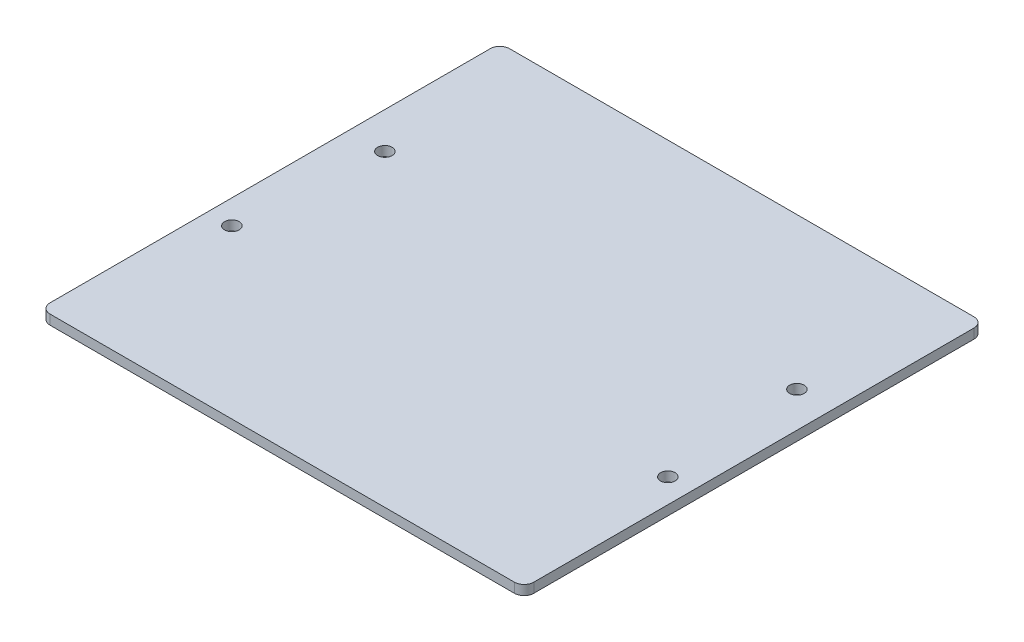
ISO-10303-21;
HEADER;
FILE_DESCRIPTION(('STEP AP214'),'2;1');
FILE_NAME('part.step','',(''),(''),'','','');
FILE_SCHEMA(('AUTOMOTIVE_DESIGN { 1 0 10303 214 1 1 1 1 }'));
ENDSEC;
DATA;
#1=APPLICATION_CONTEXT('core data for automotive mechanical design processes');
#2=APPLICATION_PROTOCOL_DEFINITION('international standard','automotive_design',2000,#1);
#3=PRODUCT_CONTEXT('',#1,'mechanical');
#4=PRODUCT('Part','Part','',(#3));
#5=PRODUCT_RELATED_PRODUCT_CATEGORY('part','',(#4));
#6=PRODUCT_DEFINITION_FORMATION('','',#4);
#7=PRODUCT_DEFINITION_CONTEXT('part definition',#1,'design');
#8=PRODUCT_DEFINITION('design','',#6,#7);
#9=PRODUCT_DEFINITION_SHAPE('','',#8);
#10=(LENGTH_UNIT() NAMED_UNIT(*) SI_UNIT(.MILLI.,.METRE.));
#11=(NAMED_UNIT(*) PLANE_ANGLE_UNIT() SI_UNIT($,.RADIAN.));
#12=(NAMED_UNIT(*) SI_UNIT($,.STERADIAN.) SOLID_ANGLE_UNIT());
#13=UNCERTAINTY_MEASURE_WITH_UNIT(LENGTH_MEASURE(1.E-05),#10,'distance_accuracy_value','');
#14=(GEOMETRIC_REPRESENTATION_CONTEXT(3) GLOBAL_UNCERTAINTY_ASSIGNED_CONTEXT((#13)) GLOBAL_UNIT_ASSIGNED_CONTEXT((#10,
#11,#12)) REPRESENTATION_CONTEXT('',''));
#15=CARTESIAN_POINT('',(0.,0.,0.));
#16=DIRECTION('',(0.,0.,1.));
#17=DIRECTION('',(1.,0.,0.));
#18=AXIS2_PLACEMENT_3D('',#15,#16,#17);
#19=CARTESIAN_POINT('',(0.,2.,0.));
#20=DIRECTION('',(0.,-1.,0.));
#21=DIRECTION('',(0.,0.,-1.));
#22=AXIS2_PLACEMENT_3D('',#19,#20,#21);
#23=PLANE('',#22);
#24=CARTESIAN_POINT('',(-45.,2.,12.906));
#25=DIRECTION('',(0.,1.,0.));
#26=DIRECTION('',(0.,0.,1.));
#27=AXIS2_PLACEMENT_3D('',#24,#25,#26);
#28=CIRCLE('',#27,1.50000000000002);
#29=CARTESIAN_POINT('',(-45.,2.,14.406));
#30=VERTEX_POINT('',#29);
#31=EDGE_CURVE('E205',#30,#30,#28,.T.);
#32=ORIENTED_EDGE('',*,*,#31,.F.);
#33=EDGE_LOOP('',(#32));
#34=FACE_BOUND('',#33,.T.);
#35=CARTESIAN_POINT('',(-42.5,2.,-16.216));
#36=DIRECTION('',(0.,1.,0.));
#37=DIRECTION('',(0.,0.,1.));
#38=AXIS2_PLACEMENT_3D('',#35,#36,#37);
#39=CIRCLE('',#38,1.50000000000002);
#40=CARTESIAN_POINT('',(-42.5,2.,-14.716));
#41=VERTEX_POINT('',#40);
#42=EDGE_CURVE('E199',#41,#41,#39,.T.);
#43=ORIENTED_EDGE('',*,*,#42,.F.);
#44=EDGE_LOOP('',(#43));
#45=FACE_BOUND('',#44,.T.);
#46=DIRECTION('',(-1.,0.,0.));
#47=VECTOR('',#46,1.);
#48=CARTESIAN_POINT('',(-50.,2.,-47.5));
#49=LINE('',#48,#47);
#50=CARTESIAN_POINT('',(48.,2.,-47.5));
#51=VERTEX_POINT('',#50);
#52=CARTESIAN_POINT('',(-48.,2.,-47.5));
#53=VERTEX_POINT('',#52);
#54=EDGE_CURVE('E173',#51,#53,#49,.T.);
#55=ORIENTED_EDGE('',*,*,#54,.T.);
#56=CARTESIAN_POINT('',(-48.,2.,-45.5));
#57=DIRECTION('',(0.,-1.,0.));
#58=DIRECTION('',(0.,0.,-1.));
#59=AXIS2_PLACEMENT_3D('',#56,#57,#58);
#60=CIRCLE('',#59,2.);
#61=CARTESIAN_POINT('',(-50.,2.,-45.5));
#62=VERTEX_POINT('',#61);
#63=EDGE_CURVE('E151',#53,#62,#60,.F.);
#64=ORIENTED_EDGE('',*,*,#63,.T.);
#65=DIRECTION('',(0.,0.,1.));
#66=VECTOR('',#65,1.);
#67=CARTESIAN_POINT('',(-50.,2.,47.5));
#68=LINE('',#67,#66);
#69=CARTESIAN_POINT('',(-50.,2.,45.5));
#70=VERTEX_POINT('',#69);
#71=EDGE_CURVE('E122',#62,#70,#68,.T.);
#72=ORIENTED_EDGE('',*,*,#71,.T.);
#73=CARTESIAN_POINT('',(-48.,2.,45.5));
#74=DIRECTION('',(0.,-1.,0.));
#75=DIRECTION('',(0.,0.,-1.));
#76=AXIS2_PLACEMENT_3D('',#73,#74,#75);
#77=CIRCLE('',#76,2.);
#78=CARTESIAN_POINT('',(-48.,2.,47.5));
#79=VERTEX_POINT('',#78);
#80=EDGE_CURVE('E58',#70,#79,#77,.F.);
#81=ORIENTED_EDGE('',*,*,#80,.T.);
#82=DIRECTION('',(1.,0.,0.));
#83=VECTOR('',#82,1.);
#84=CARTESIAN_POINT('',(-50.,2.,47.5));
#85=LINE('',#84,#83);
#86=CARTESIAN_POINT('',(48.,2.,47.5));
#87=VERTEX_POINT('',#86);
#88=EDGE_CURVE('E137',#79,#87,#85,.T.);
#89=ORIENTED_EDGE('',*,*,#88,.T.);
#90=CARTESIAN_POINT('',(48.,2.,45.5));
#91=DIRECTION('',(0.,-1.,0.));
#92=DIRECTION('',(0.,0.,-1.));
#93=AXIS2_PLACEMENT_3D('',#90,#91,#92);
#94=CIRCLE('',#93,2.);
#95=CARTESIAN_POINT('',(50.,2.,45.5));
#96=VERTEX_POINT('',#95);
#97=EDGE_CURVE('E147',#87,#96,#94,.F.);
#98=ORIENTED_EDGE('',*,*,#97,.T.);
#99=DIRECTION('',(0.,0.,-1.));
#100=VECTOR('',#99,1.);
#101=CARTESIAN_POINT('',(50.,2.,47.5));
#102=LINE('',#101,#100);
#103=CARTESIAN_POINT('',(50.,2.,-45.5));
#104=VERTEX_POINT('',#103);
#105=EDGE_CURVE('E131',#96,#104,#102,.T.);
#106=ORIENTED_EDGE('',*,*,#105,.T.);
#107=CARTESIAN_POINT('',(48.,2.,-45.5));
#108=DIRECTION('',(0.,-1.,0.));
#109=DIRECTION('',(0.,0.,-1.));
#110=AXIS2_PLACEMENT_3D('',#107,#108,#109);
#111=CIRCLE('',#110,2.);
#112=EDGE_CURVE('E149',#104,#51,#111,.F.);
#113=ORIENTED_EDGE('',*,*,#112,.T.);
#114=EDGE_LOOP('',(#55,#64,#72,#81,#89,#98,#106,#113));
#115=FACE_BOUND('',#114,.T.);
#116=CARTESIAN_POINT('',(45.,2.,12.784));
#117=DIRECTION('',(0.,1.,0.));
#118=DIRECTION('',(0.,0.,1.));
#119=AXIS2_PLACEMENT_3D('',#116,#117,#118);
#120=CIRCLE('',#119,1.50000000000002);
#121=CARTESIAN_POINT('',(45.,2.,14.284));
#122=VERTEX_POINT('',#121);
#123=EDGE_CURVE('E183',#122,#122,#120,.T.);
#124=ORIENTED_EDGE('',*,*,#123,.F.);
#125=EDGE_LOOP('',(#124));
#126=FACE_BOUND('',#125,.T.);
#127=CARTESIAN_POINT('',(42.673,2.,-16.216));
#128=DIRECTION('',(0.,1.,0.));
#129=DIRECTION('',(0.,0.,1.));
#130=AXIS2_PLACEMENT_3D('',#127,#128,#129);
#131=CIRCLE('',#130,1.50000000000002);
#132=CARTESIAN_POINT('',(42.673,2.,-14.716));
#133=VERTEX_POINT('',#132);
#134=EDGE_CURVE('E191',#133,#133,#131,.T.);
#135=ORIENTED_EDGE('',*,*,#134,.F.);
#136=EDGE_LOOP('',(#135));
#137=FACE_BOUND('',#136,.T.);
#138=ADVANCED_FACE('F38',(#34,#45,#115,#126,#137),#23,.F.);
#139=CARTESIAN_POINT('',(50.,2.,47.5));
#140=DIRECTION('',(-1.,0.,0.));
#141=DIRECTION('',(0.,0.,1.));
#142=AXIS2_PLACEMENT_3D('',#139,#140,#141);
#143=PLANE('',#142);
#144=DIRECTION('',(0.,0.,-1.));
#145=VECTOR('',#144,1.);
#146=CARTESIAN_POINT('',(50.,0.,47.5));
#147=LINE('',#146,#145);
#148=CARTESIAN_POINT('',(50.,0.,45.5));
#149=VERTEX_POINT('',#148);
#150=CARTESIAN_POINT('',(50.,0.,-45.5));
#151=VERTEX_POINT('',#150);
#152=EDGE_CURVE('E133',#149,#151,#147,.T.);
#153=ORIENTED_EDGE('',*,*,#152,.T.);
#154=DIRECTION('',(0.,-1.,0.));
#155=VECTOR('',#154,1.);
#156=CARTESIAN_POINT('',(50.,2.,-45.5));
#157=LINE('',#156,#155);
#158=EDGE_CURVE('E156',#151,#104,#157,.F.);
#159=ORIENTED_EDGE('',*,*,#158,.T.);
#160=ORIENTED_EDGE('',*,*,#105,.F.);
#161=DIRECTION('',(0.,-1.,0.));
#162=VECTOR('',#161,1.);
#163=CARTESIAN_POINT('',(50.,2.,45.5));
#164=LINE('',#163,#162);
#165=EDGE_CURVE('E153',#96,#149,#164,.T.);
#166=ORIENTED_EDGE('',*,*,#165,.T.);
#167=EDGE_LOOP('',(#153,#159,#160,#166));
#168=FACE_BOUND('',#167,.T.);
#169=ADVANCED_FACE('F169',(#168),#143,.F.);
#170=CARTESIAN_POINT('',(-50.,2.,-47.5));
#171=DIRECTION('',(0.,0.,1.));
#172=DIRECTION('',(1.,0.,0.));
#173=AXIS2_PLACEMENT_3D('',#170,#171,#172);
#174=PLANE('',#173);
#175=DIRECTION('',(-1.,0.,0.));
#176=VECTOR('',#175,1.);
#177=CARTESIAN_POINT('',(-50.,0.,-47.5));
#178=LINE('',#177,#176);
#179=CARTESIAN_POINT('',(48.,0.,-47.5));
#180=VERTEX_POINT('',#179);
#181=CARTESIAN_POINT('',(-48.,0.,-47.5));
#182=VERTEX_POINT('',#181);
#183=EDGE_CURVE('E129',#180,#182,#178,.T.);
#184=ORIENTED_EDGE('',*,*,#183,.T.);
#185=DIRECTION('',(0.,-1.,0.));
#186=VECTOR('',#185,1.);
#187=CARTESIAN_POINT('',(-48.,2.,-47.5));
#188=LINE('',#187,#186);
#189=EDGE_CURVE('E108',#182,#53,#188,.F.);
#190=ORIENTED_EDGE('',*,*,#189,.T.);
#191=ORIENTED_EDGE('',*,*,#54,.F.);
#192=DIRECTION('',(0.,-1.,0.));
#193=VECTOR('',#192,1.);
#194=CARTESIAN_POINT('',(48.,2.,-47.5));
#195=LINE('',#194,#193);
#196=EDGE_CURVE('E113',#51,#180,#195,.T.);
#197=ORIENTED_EDGE('',*,*,#196,.T.);
#198=EDGE_LOOP('',(#184,#190,#191,#197));
#199=FACE_BOUND('',#198,.T.);
#200=ADVANCED_FACE('F245',(#199),#174,.F.);
#201=CARTESIAN_POINT('',(-50.,2.,47.5));
#202=DIRECTION('',(1.,0.,0.));
#203=DIRECTION('',(0.,0.,-1.));
#204=AXIS2_PLACEMENT_3D('',#201,#202,#203);
#205=PLANE('',#204);
#206=ORIENTED_EDGE('',*,*,#71,.F.);
#207=DIRECTION('',(0.,-1.,0.));
#208=VECTOR('',#207,1.);
#209=CARTESIAN_POINT('',(-50.,2.,-45.5));
#210=LINE('',#209,#208);
#211=CARTESIAN_POINT('',(-50.,0.,-45.5));
#212=VERTEX_POINT('',#211);
#213=EDGE_CURVE('E107',#62,#212,#210,.T.);
#214=ORIENTED_EDGE('',*,*,#213,.T.);
#215=DIRECTION('',(0.,0.,1.));
#216=VECTOR('',#215,1.);
#217=CARTESIAN_POINT('',(-50.,0.,47.5));
#218=LINE('',#217,#216);
#219=CARTESIAN_POINT('',(-50.,0.,45.5));
#220=VERTEX_POINT('',#219);
#221=EDGE_CURVE('E120',#212,#220,#218,.T.);
#222=ORIENTED_EDGE('',*,*,#221,.T.);
#223=DIRECTION('',(0.,-1.,0.));
#224=VECTOR('',#223,1.);
#225=CARTESIAN_POINT('',(-50.,2.,45.5));
#226=LINE('',#225,#224);
#227=EDGE_CURVE('E124',#220,#70,#226,.F.);
#228=ORIENTED_EDGE('',*,*,#227,.T.);
#229=EDGE_LOOP('',(#206,#214,#222,#228));
#230=FACE_BOUND('',#229,.T.);
#231=ADVANCED_FACE('F119',(#230),#205,.F.);
#232=CARTESIAN_POINT('',(-50.,2.,47.5));
#233=DIRECTION('',(0.,0.,-1.));
#234=DIRECTION('',(-1.,0.,0.));
#235=AXIS2_PLACEMENT_3D('',#232,#233,#234);
#236=PLANE('',#235);
#237=DIRECTION('',(1.,0.,0.));
#238=VECTOR('',#237,1.);
#239=CARTESIAN_POINT('',(-50.,0.,47.5));
#240=LINE('',#239,#238);
#241=CARTESIAN_POINT('',(-48.,0.,47.5));
#242=VERTEX_POINT('',#241);
#243=CARTESIAN_POINT('',(48.,0.,47.5));
#244=VERTEX_POINT('',#243);
#245=EDGE_CURVE('E128',#242,#244,#240,.T.);
#246=ORIENTED_EDGE('',*,*,#245,.T.);
#247=DIRECTION('',(0.,-1.,0.));
#248=VECTOR('',#247,1.);
#249=CARTESIAN_POINT('',(48.,2.,47.5));
#250=LINE('',#249,#248);
#251=EDGE_CURVE('E11',#244,#87,#250,.F.);
#252=ORIENTED_EDGE('',*,*,#251,.T.);
#253=ORIENTED_EDGE('',*,*,#88,.F.);
#254=DIRECTION('',(0.,-1.,0.));
#255=VECTOR('',#254,1.);
#256=CARTESIAN_POINT('',(-48.,2.,47.5));
#257=LINE('',#256,#255);
#258=EDGE_CURVE('E46',#79,#242,#257,.T.);
#259=ORIENTED_EDGE('',*,*,#258,.T.);
#260=EDGE_LOOP('',(#246,#252,#253,#259));
#261=FACE_BOUND('',#260,.T.);
#262=ADVANCED_FACE('F159',(#261),#236,.F.);
#263=CARTESIAN_POINT('',(0.,0.,0.));
#264=DIRECTION('',(0.,-1.,0.));
#265=DIRECTION('',(0.,0.,-1.));
#266=AXIS2_PLACEMENT_3D('',#263,#264,#265);
#267=PLANE('',#266);
#268=CARTESIAN_POINT('',(-45.,0.,12.906));
#269=DIRECTION('',(0.,-1.,0.));
#270=DIRECTION('',(0.,0.,-1.));
#271=AXIS2_PLACEMENT_3D('',#268,#269,#270);
#272=CIRCLE('',#271,1.50000000000002);
#273=CARTESIAN_POINT('',(-45.,0.,11.406));
#274=VERTEX_POINT('',#273);
#275=EDGE_CURVE('E202',#274,#274,#272,.T.);
#276=ORIENTED_EDGE('',*,*,#275,.F.);
#277=EDGE_LOOP('',(#276));
#278=FACE_BOUND('',#277,.T.);
#279=CARTESIAN_POINT('',(-42.5,0.,-16.216));
#280=DIRECTION('',(0.,-1.,0.));
#281=DIRECTION('',(0.,0.,-1.));
#282=AXIS2_PLACEMENT_3D('',#279,#280,#281);
#283=CIRCLE('',#282,1.50000000000002);
#284=CARTESIAN_POINT('',(-42.5,0.,-17.716));
#285=VERTEX_POINT('',#284);
#286=EDGE_CURVE('E196',#285,#285,#283,.T.);
#287=ORIENTED_EDGE('',*,*,#286,.F.);
#288=EDGE_LOOP('',(#287));
#289=FACE_BOUND('',#288,.T.);
#290=CARTESIAN_POINT('',(42.673,0.,-16.216));
#291=DIRECTION('',(0.,-1.,0.));
#292=DIRECTION('',(0.,0.,-1.));
#293=AXIS2_PLACEMENT_3D('',#290,#291,#292);
#294=CIRCLE('',#293,1.50000000000002);
#295=CARTESIAN_POINT('',(42.673,0.,-17.716));
#296=VERTEX_POINT('',#295);
#297=EDGE_CURVE('E187',#296,#296,#294,.T.);
#298=ORIENTED_EDGE('',*,*,#297,.F.);
#299=EDGE_LOOP('',(#298));
#300=FACE_BOUND('',#299,.T.);
#301=CARTESIAN_POINT('',(45.,0.,12.784));
#302=DIRECTION('',(0.,-1.,0.));
#303=DIRECTION('',(0.,0.,-1.));
#304=AXIS2_PLACEMENT_3D('',#301,#302,#303);
#305=CIRCLE('',#304,1.50000000000002);
#306=CARTESIAN_POINT('',(45.,0.,11.284));
#307=VERTEX_POINT('',#306);
#308=EDGE_CURVE('E178',#307,#307,#305,.T.);
#309=ORIENTED_EDGE('',*,*,#308,.F.);
#310=EDGE_LOOP('',(#309));
#311=FACE_BOUND('',#310,.T.);
#312=ORIENTED_EDGE('',*,*,#221,.F.);
#313=CARTESIAN_POINT('',(-48.,0.,-45.5));
#314=DIRECTION('',(0.,-1.,0.));
#315=DIRECTION('',(0.,0.,-1.));
#316=AXIS2_PLACEMENT_3D('',#313,#314,#315);
#317=CIRCLE('',#316,2.);
#318=EDGE_CURVE('E103',#212,#182,#317,.T.);
#319=ORIENTED_EDGE('',*,*,#318,.T.);
#320=ORIENTED_EDGE('',*,*,#183,.F.);
#321=CARTESIAN_POINT('',(48.,0.,-45.5));
#322=DIRECTION('',(0.,-1.,0.));
#323=DIRECTION('',(0.,0.,-1.));
#324=AXIS2_PLACEMENT_3D('',#321,#322,#323);
#325=CIRCLE('',#324,2.);
#326=EDGE_CURVE('E114',#180,#151,#325,.T.);
#327=ORIENTED_EDGE('',*,*,#326,.T.);
#328=ORIENTED_EDGE('',*,*,#152,.F.);
#329=CARTESIAN_POINT('',(48.,0.,45.5));
#330=DIRECTION('',(0.,-1.,0.));
#331=DIRECTION('',(0.,0.,-1.));
#332=AXIS2_PLACEMENT_3D('',#329,#330,#331);
#333=CIRCLE('',#332,2.);
#334=EDGE_CURVE('E140',#149,#244,#333,.T.);
#335=ORIENTED_EDGE('',*,*,#334,.T.);
#336=ORIENTED_EDGE('',*,*,#245,.F.);
#337=CARTESIAN_POINT('',(-48.,0.,45.5));
#338=DIRECTION('',(0.,-1.,0.));
#339=DIRECTION('',(0.,0.,-1.));
#340=AXIS2_PLACEMENT_3D('',#337,#338,#339);
#341=CIRCLE('',#340,2.);
#342=EDGE_CURVE('E123',#242,#220,#341,.T.);
#343=ORIENTED_EDGE('',*,*,#342,.T.);
#344=EDGE_LOOP('',(#312,#319,#320,#327,#328,#335,#336,#343));
#345=FACE_BOUND('',#344,.T.);
#346=ADVANCED_FACE('F126',(#278,#289,#300,#311,#345),#267,.T.);
#347=CARTESIAN_POINT('',(45.,2.,12.784));
#348=DIRECTION('',(0.,1.,0.));
#349=DIRECTION('',(0.,0.,1.));
#350=AXIS2_PLACEMENT_3D('',#347,#348,#349);
#351=CYLINDRICAL_SURFACE('',#350,1.50000000000002);
#352=ORIENTED_EDGE('',*,*,#123,.T.);
#353=EDGE_LOOP('',(#352));
#354=FACE_BOUND('',#353,.T.);
#355=ORIENTED_EDGE('',*,*,#308,.T.);
#356=EDGE_LOOP('',(#355));
#357=FACE_BOUND('',#356,.T.);
#358=ADVANCED_FACE('F225',(#354,#357),#351,.F.);
#359=CARTESIAN_POINT('',(42.673,2.,-16.216));
#360=DIRECTION('',(0.,1.,0.));
#361=DIRECTION('',(0.,0.,1.));
#362=AXIS2_PLACEMENT_3D('',#359,#360,#361);
#363=CYLINDRICAL_SURFACE('',#362,1.50000000000002);
#364=ORIENTED_EDGE('',*,*,#134,.T.);
#365=EDGE_LOOP('',(#364));
#366=FACE_BOUND('',#365,.T.);
#367=ORIENTED_EDGE('',*,*,#297,.T.);
#368=EDGE_LOOP('',(#367));
#369=FACE_BOUND('',#368,.T.);
#370=ADVANCED_FACE('F221',(#366,#369),#363,.F.);
#371=CARTESIAN_POINT('',(-42.5,2.,-16.216));
#372=DIRECTION('',(0.,1.,0.));
#373=DIRECTION('',(0.,0.,1.));
#374=AXIS2_PLACEMENT_3D('',#371,#372,#373);
#375=CYLINDRICAL_SURFACE('',#374,1.50000000000002);
#376=ORIENTED_EDGE('',*,*,#42,.T.);
#377=EDGE_LOOP('',(#376));
#378=FACE_BOUND('',#377,.T.);
#379=ORIENTED_EDGE('',*,*,#286,.T.);
#380=EDGE_LOOP('',(#379));
#381=FACE_BOUND('',#380,.T.);
#382=ADVANCED_FACE('F224',(#378,#381),#375,.F.);
#383=CARTESIAN_POINT('',(-45.,2.,12.906));
#384=DIRECTION('',(0.,1.,0.));
#385=DIRECTION('',(0.,0.,1.));
#386=AXIS2_PLACEMENT_3D('',#383,#384,#385);
#387=CYLINDRICAL_SURFACE('',#386,1.50000000000002);
#388=ORIENTED_EDGE('',*,*,#31,.T.);
#389=EDGE_LOOP('',(#388));
#390=FACE_BOUND('',#389,.T.);
#391=ORIENTED_EDGE('',*,*,#275,.T.);
#392=EDGE_LOOP('',(#391));
#393=FACE_BOUND('',#392,.T.);
#394=ADVANCED_FACE('F209',(#390,#393),#387,.F.);
#395=CARTESIAN_POINT('',(-48.,2.,-45.5));
#396=DIRECTION('',(0.,-1.,0.));
#397=DIRECTION('',(0.,0.,-1.));
#398=AXIS2_PLACEMENT_3D('',#395,#396,#397);
#399=CYLINDRICAL_SURFACE('',#398,2.);
#400=ORIENTED_EDGE('',*,*,#63,.F.);
#401=ORIENTED_EDGE('',*,*,#189,.F.);
#402=ORIENTED_EDGE('',*,*,#318,.F.);
#403=ORIENTED_EDGE('',*,*,#213,.F.);
#404=EDGE_LOOP('',(#400,#401,#402,#403));
#405=FACE_BOUND('',#404,.T.);
#406=ADVANCED_FACE('F106',(#405),#399,.T.);
#407=CARTESIAN_POINT('',(48.,2.,-45.5));
#408=DIRECTION('',(0.,-1.,0.));
#409=DIRECTION('',(0.,0.,-1.));
#410=AXIS2_PLACEMENT_3D('',#407,#408,#409);
#411=CYLINDRICAL_SURFACE('',#410,2.);
#412=ORIENTED_EDGE('',*,*,#112,.F.);
#413=ORIENTED_EDGE('',*,*,#158,.F.);
#414=ORIENTED_EDGE('',*,*,#326,.F.);
#415=ORIENTED_EDGE('',*,*,#196,.F.);
#416=EDGE_LOOP('',(#412,#413,#414,#415));
#417=FACE_BOUND('',#416,.T.);
#418=ADVANCED_FACE('F252',(#417),#411,.T.);
#419=CARTESIAN_POINT('',(48.,2.,45.5));
#420=DIRECTION('',(0.,-1.,0.));
#421=DIRECTION('',(0.,0.,-1.));
#422=AXIS2_PLACEMENT_3D('',#419,#420,#421);
#423=CYLINDRICAL_SURFACE('',#422,2.);
#424=ORIENTED_EDGE('',*,*,#97,.F.);
#425=ORIENTED_EDGE('',*,*,#251,.F.);
#426=ORIENTED_EDGE('',*,*,#334,.F.);
#427=ORIENTED_EDGE('',*,*,#165,.F.);
#428=EDGE_LOOP('',(#424,#425,#426,#427));
#429=FACE_BOUND('',#428,.T.);
#430=ADVANCED_FACE('F166',(#429),#423,.T.);
#431=CARTESIAN_POINT('',(-48.,2.,45.5));
#432=DIRECTION('',(0.,-1.,0.));
#433=DIRECTION('',(0.,0.,-1.));
#434=AXIS2_PLACEMENT_3D('',#431,#432,#433);
#435=CYLINDRICAL_SURFACE('',#434,2.);
#436=ORIENTED_EDGE('',*,*,#80,.F.);
#437=ORIENTED_EDGE('',*,*,#227,.F.);
#438=ORIENTED_EDGE('',*,*,#342,.F.);
#439=ORIENTED_EDGE('',*,*,#258,.F.);
#440=EDGE_LOOP('',(#436,#437,#438,#439));
#441=FACE_BOUND('',#440,.T.);
#442=ADVANCED_FACE('F40',(#441),#435,.T.);
#443=CLOSED_SHELL('',(#138,#169,#200,#231,#262,#346,#358,#370,#382,#394,#406,#418,#430,#442));
#444=MANIFOLD_SOLID_BREP('B2',#443);
#445=ADVANCED_BREP_SHAPE_REPRESENTATION('',(#18,#444),#14);
#446=SHAPE_DEFINITION_REPRESENTATION(#9,#445);
ENDSEC;
END-ISO-10303-21;
